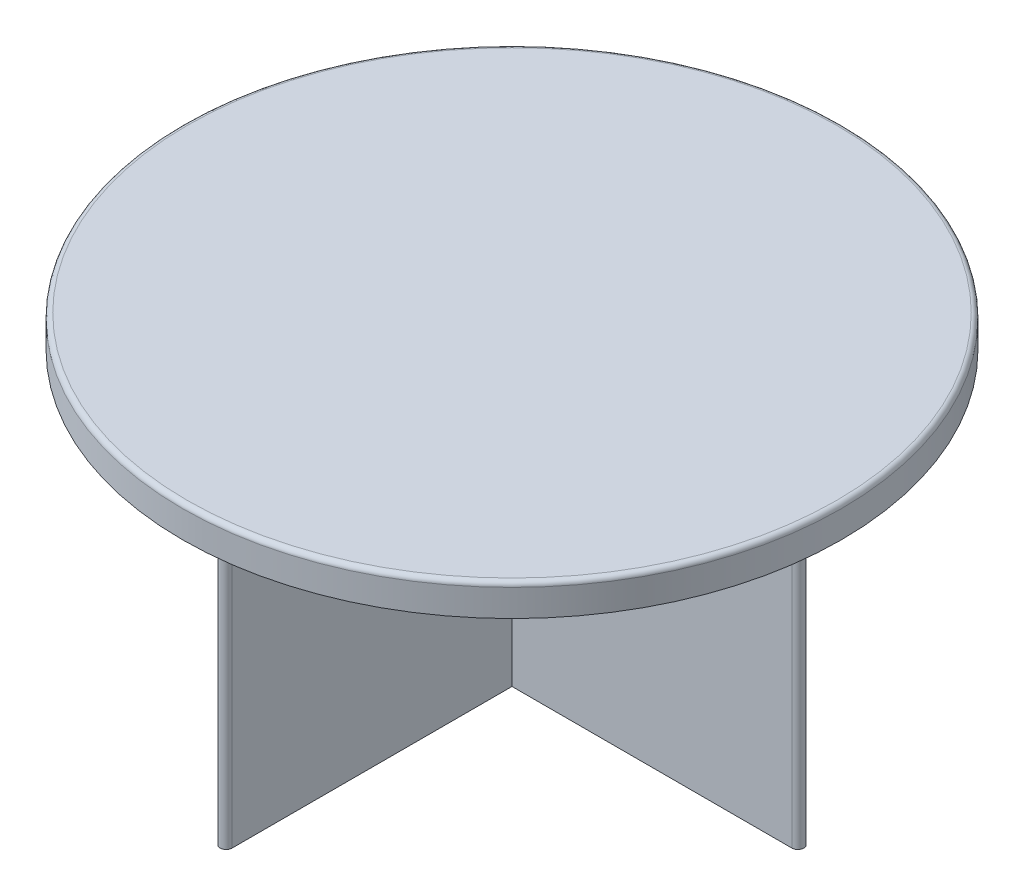
ISO-10303-21;
HEADER;
FILE_DESCRIPTION(('STEP AP214'),'2;1');
FILE_NAME('part.step','',(''),(''),'','','');
FILE_SCHEMA(('AUTOMOTIVE_DESIGN { 1 0 10303 214 1 1 1 1 }'));
ENDSEC;
DATA;
#1=APPLICATION_CONTEXT('core data for automotive mechanical design processes');
#2=APPLICATION_PROTOCOL_DEFINITION('international standard','automotive_design',2000,#1);
#3=PRODUCT_CONTEXT('',#1,'mechanical');
#4=PRODUCT('Part','Part','',(#3));
#5=PRODUCT_RELATED_PRODUCT_CATEGORY('part','',(#4));
#6=PRODUCT_DEFINITION_FORMATION('','',#4);
#7=PRODUCT_DEFINITION_CONTEXT('part definition',#1,'design');
#8=PRODUCT_DEFINITION('design','',#6,#7);
#9=PRODUCT_DEFINITION_SHAPE('','',#8);
#10=(LENGTH_UNIT() NAMED_UNIT(*) SI_UNIT(.MILLI.,.METRE.));
#11=(NAMED_UNIT(*) PLANE_ANGLE_UNIT() SI_UNIT($,.RADIAN.));
#12=(NAMED_UNIT(*) SI_UNIT($,.STERADIAN.) SOLID_ANGLE_UNIT());
#13=UNCERTAINTY_MEASURE_WITH_UNIT(LENGTH_MEASURE(1.E-05),#10,'distance_accuracy_value','');
#14=(GEOMETRIC_REPRESENTATION_CONTEXT(3) GLOBAL_UNCERTAINTY_ASSIGNED_CONTEXT((#13)) GLOBAL_UNIT_ASSIGNED_CONTEXT((#10,
#11,#12)) REPRESENTATION_CONTEXT('',''));
#15=CARTESIAN_POINT('',(0.,0.,0.));
#16=DIRECTION('',(0.,0.,1.));
#17=DIRECTION('',(1.,0.,0.));
#18=AXIS2_PLACEMENT_3D('',#15,#16,#17);
#19=CARTESIAN_POINT('',(0.,50.8,0.));
#20=DIRECTION('',(0.,-1.,0.));
#21=DIRECTION('',(0.,0.,-1.));
#22=AXIS2_PLACEMENT_3D('',#19,#20,#21);
#23=CYLINDRICAL_SURFACE('',#22,527.05);
#24=CARTESIAN_POINT('',(0.,43.18,0.));
#25=DIRECTION('',(0.,1.,0.));
#26=DIRECTION('',(0.,0.,1.));
#27=AXIS2_PLACEMENT_3D('',#24,#25,#26);
#28=CIRCLE('',#27,527.05);
#29=CARTESIAN_POINT('',(0.,43.18,527.05));
#30=VERTEX_POINT('',#29);
#31=EDGE_CURVE('E12',#30,#30,#28,.F.);
#32=ORIENTED_EDGE('',*,*,#31,.T.);
#33=EDGE_LOOP('',(#32));
#34=FACE_BOUND('',#33,.T.);
#35=CARTESIAN_POINT('',(0.,0.,0.));
#36=DIRECTION('',(0.,1.,0.));
#37=DIRECTION('',(0.,0.,1.));
#38=AXIS2_PLACEMENT_3D('',#35,#36,#37);
#39=CIRCLE('',#38,527.05);
#40=CARTESIAN_POINT('',(0.,0.,527.05));
#41=VERTEX_POINT('',#40);
#42=EDGE_CURVE('E163',#41,#41,#39,.T.);
#43=ORIENTED_EDGE('',*,*,#42,.T.);
#44=EDGE_LOOP('',(#43));
#45=FACE_BOUND('',#44,.T.);
#46=ADVANCED_FACE('F57',(#34,#45),#23,.T.);
#47=CARTESIAN_POINT('',(0.,50.8,0.));
#48=DIRECTION('',(0.,1.,0.));
#49=DIRECTION('',(0.,0.,1.));
#50=AXIS2_PLACEMENT_3D('',#47,#48,#49);
#51=PLANE('',#50);
#52=CARTESIAN_POINT('',(0.,50.8,0.));
#53=DIRECTION('',(0.,1.,0.));
#54=DIRECTION('',(0.,0.,1.));
#55=AXIS2_PLACEMENT_3D('',#52,#53,#54);
#56=CIRCLE('',#55,519.43);
#57=CARTESIAN_POINT('',(0.,50.8,519.43));
#58=VERTEX_POINT('',#57);
#59=EDGE_CURVE('E65',#58,#58,#56,.T.);
#60=ORIENTED_EDGE('',*,*,#59,.T.);
#61=EDGE_LOOP('',(#60));
#62=FACE_BOUND('',#61,.T.);
#63=ADVANCED_FACE('F168',(#62),#51,.T.);
#64=CARTESIAN_POINT('',(0.,0.,0.));
#65=DIRECTION('',(0.,1.,0.));
#66=DIRECTION('',(0.,0.,1.));
#67=AXIS2_PLACEMENT_3D('',#64,#65,#66);
#68=PLANE('',#67);
#69=CARTESIAN_POINT('',(-1.61109058612508E-13,0.,457.2));
#70=DIRECTION('',(0.,1.,0.));
#71=DIRECTION('',(0.,0.,1.));
#72=AXIS2_PLACEMENT_3D('',#69,#70,#71);
#73=CIRCLE('',#72,9.525);
#74=CARTESIAN_POINT('',(-9.52500000000016,0.,457.2));
#75=VERTEX_POINT('',#74);
#76=CARTESIAN_POINT('',(9.52499999999984,0.,457.2));
#77=VERTEX_POINT('',#76);
#78=EDGE_CURVE('E127',#75,#77,#73,.T.);
#79=ORIENTED_EDGE('',*,*,#78,.T.);
#80=DIRECTION('',(0.,0.,-1.));
#81=VECTOR('',#80,1.);
#82=CARTESIAN_POINT('',(9.52499999999984,0.,457.2));
#83=LINE('',#82,#81);
#84=CARTESIAN_POINT('',(9.52499999999984,0.,9.525));
#85=VERTEX_POINT('',#84);
#86=EDGE_CURVE('E268',#77,#85,#83,.T.);
#87=ORIENTED_EDGE('',*,*,#86,.T.);
#88=DIRECTION('',(1.,0.,0.));
#89=VECTOR('',#88,1.);
#90=CARTESIAN_POINT('',(-457.2,0.,9.525));
#91=LINE('',#90,#89);
#92=CARTESIAN_POINT('',(457.2,0.,9.525));
#93=VERTEX_POINT('',#92);
#94=EDGE_CURVE('E246',#85,#93,#91,.T.);
#95=ORIENTED_EDGE('',*,*,#94,.T.);
#96=CARTESIAN_POINT('',(457.2,0.,1.67972554971051E-13));
#97=DIRECTION('',(0.,-1.,0.));
#98=DIRECTION('',(0.,0.,-1.));
#99=AXIS2_PLACEMENT_3D('',#96,#97,#98);
#100=CIRCLE('',#99,9.525);
#101=CARTESIAN_POINT('',(457.2,0.,-9.52499999999983));
#102=VERTEX_POINT('',#101);
#103=EDGE_CURVE('E248',#102,#93,#100,.T.);
#104=ORIENTED_EDGE('',*,*,#103,.F.);
#105=DIRECTION('',(1.,0.,0.));
#106=VECTOR('',#105,1.);
#107=CARTESIAN_POINT('',(-457.2,0.,-9.525));
#108=LINE('',#107,#106);
#109=CARTESIAN_POINT('',(9.52499999999984,0.,-9.525));
#110=VERTEX_POINT('',#109);
#111=EDGE_CURVE('E251',#110,#102,#108,.T.);
#112=ORIENTED_EDGE('',*,*,#111,.F.);
#113=CARTESIAN_POINT('',(9.52499999999984,0.,-457.2));
#114=VERTEX_POINT('',#113);
#115=EDGE_CURVE('E133',#110,#114,#83,.T.);
#116=ORIENTED_EDGE('',*,*,#115,.T.);
#117=CARTESIAN_POINT('',(1.18845199672577E-13,0.,-457.2));
#118=DIRECTION('',(0.,-1.,0.));
#119=DIRECTION('',(0.,0.,-1.));
#120=AXIS2_PLACEMENT_3D('',#117,#118,#119);
#121=CIRCLE('',#120,9.525);
#122=CARTESIAN_POINT('',(-9.52499999999988,0.,-457.2));
#123=VERTEX_POINT('',#122);
#124=EDGE_CURVE('E72',#123,#114,#121,.T.);
#125=ORIENTED_EDGE('',*,*,#124,.F.);
#126=DIRECTION('',(0.,0.,-1.));
#127=VECTOR('',#126,1.);
#128=CARTESIAN_POINT('',(-9.52500000000016,0.,457.2));
#129=LINE('',#128,#127);
#130=CARTESIAN_POINT('',(-9.52500000000017,0.,-9.525));
#131=VERTEX_POINT('',#130);
#132=EDGE_CURVE('E141',#131,#123,#129,.T.);
#133=ORIENTED_EDGE('',*,*,#132,.F.);
#134=CARTESIAN_POINT('',(-457.2,0.,-9.525));
#135=VERTEX_POINT('',#134);
#136=EDGE_CURVE('E236',#135,#131,#108,.T.);
#137=ORIENTED_EDGE('',*,*,#136,.F.);
#138=CARTESIAN_POINT('',(-457.2,0.,0.));
#139=DIRECTION('',(0.,1.,0.));
#140=DIRECTION('',(0.,0.,1.));
#141=AXIS2_PLACEMENT_3D('',#138,#139,#140);
#142=CIRCLE('',#141,9.525);
#143=CARTESIAN_POINT('',(-457.2,0.,9.525));
#144=VERTEX_POINT('',#143);
#145=EDGE_CURVE('E123',#135,#144,#142,.T.);
#146=ORIENTED_EDGE('',*,*,#145,.T.);
#147=CARTESIAN_POINT('',(-9.52500000000017,0.,9.525));
#148=VERTEX_POINT('',#147);
#149=EDGE_CURVE('E139',#144,#148,#91,.T.);
#150=ORIENTED_EDGE('',*,*,#149,.T.);
#151=EDGE_CURVE('E116',#75,#148,#129,.T.);
#152=ORIENTED_EDGE('',*,*,#151,.F.);
#153=EDGE_LOOP('',(#79,#87,#95,#104,#112,#116,#125,#133,#137,#146,#150,#152));
#154=FACE_BOUND('',#153,.T.);
#155=ORIENTED_EDGE('',*,*,#42,.F.);
#156=EDGE_LOOP('',(#155));
#157=FACE_BOUND('',#156,.T.);
#158=ADVANCED_FACE('F135',(#154,#157),#68,.F.);
#159=CARTESIAN_POINT('',(0.,43.18,0.));
#160=DIRECTION('',(0.,1.,0.));
#161=DIRECTION('',(0.,0.,1.));
#162=AXIS2_PLACEMENT_3D('',#159,#160,#161);
#163=TOROIDAL_SURFACE('',#162,519.43,7.62);
#164=ORIENTED_EDGE('',*,*,#31,.F.);
#165=EDGE_LOOP('',(#164));
#166=FACE_BOUND('',#165,.T.);
#167=ORIENTED_EDGE('',*,*,#59,.F.);
#168=EDGE_LOOP('',(#167));
#169=FACE_BOUND('',#168,.T.);
#170=ADVANCED_FACE('F59',(#166,#169),#163,.T.);
#171=CARTESIAN_POINT('',(-457.2,-457.2,-9.525));
#172=DIRECTION('',(0.,0.,1.));
#173=DIRECTION('',(1.,0.,0.));
#174=AXIS2_PLACEMENT_3D('',#171,#172,#173);
#175=PLANE('',#174);
#176=DIRECTION('',(1.,0.,0.));
#177=VECTOR('',#176,1.);
#178=CARTESIAN_POINT('',(-457.2,-457.2,-9.525));
#179=LINE('',#178,#177);
#180=CARTESIAN_POINT('',(9.52499999999984,-457.2,-9.525));
#181=VERTEX_POINT('',#180);
#182=CARTESIAN_POINT('',(457.2,-457.2,-9.52499999999983));
#183=VERTEX_POINT('',#182);
#184=EDGE_CURVE('E240',#181,#183,#179,.T.);
#185=ORIENTED_EDGE('',*,*,#184,.F.);
#186=DIRECTION('',(0.,1.,0.));
#187=VECTOR('',#186,1.);
#188=CARTESIAN_POINT('',(9.52499999999984,-457.2,-9.525));
#189=LINE('',#188,#187);
#190=EDGE_CURVE('E155',#181,#110,#189,.T.);
#191=ORIENTED_EDGE('',*,*,#190,.T.);
#192=ORIENTED_EDGE('',*,*,#111,.T.);
#193=DIRECTION('',(0.,1.,0.));
#194=VECTOR('',#193,1.);
#195=CARTESIAN_POINT('',(457.2,-457.2,-9.52499999999983));
#196=LINE('',#195,#194);
#197=EDGE_CURVE('E256',#183,#102,#196,.T.);
#198=ORIENTED_EDGE('',*,*,#197,.F.);
#199=EDGE_LOOP('',(#185,#191,#192,#198));
#200=FACE_BOUND('',#199,.T.);
#201=ADVANCED_FACE('F171',(#200),#175,.F.);
#202=CARTESIAN_POINT('',(457.2,-457.2,1.67972554971051E-13));
#203=DIRECTION('',(0.,1.,0.));
#204=DIRECTION('',(0.,0.,1.));
#205=AXIS2_PLACEMENT_3D('',#202,#203,#204);
#206=CYLINDRICAL_SURFACE('',#205,9.525);
#207=ORIENTED_EDGE('',*,*,#103,.T.);
#208=DIRECTION('',(0.,1.,0.));
#209=VECTOR('',#208,1.);
#210=CARTESIAN_POINT('',(457.2,-457.2,9.525));
#211=LINE('',#210,#209);
#212=CARTESIAN_POINT('',(457.2,-457.2,9.525));
#213=VERTEX_POINT('',#212);
#214=EDGE_CURVE('E259',#213,#93,#211,.T.);
#215=ORIENTED_EDGE('',*,*,#214,.F.);
#216=CARTESIAN_POINT('',(457.2,-457.2,1.67972554971051E-13));
#217=DIRECTION('',(0.,-1.,0.));
#218=DIRECTION('',(0.,0.,-1.));
#219=AXIS2_PLACEMENT_3D('',#216,#217,#218);
#220=CIRCLE('',#219,9.525);
#221=EDGE_CURVE('E228',#183,#213,#220,.T.);
#222=ORIENTED_EDGE('',*,*,#221,.F.);
#223=ORIENTED_EDGE('',*,*,#197,.T.);
#224=EDGE_LOOP('',(#207,#215,#222,#223));
#225=FACE_BOUND('',#224,.T.);
#226=ADVANCED_FACE('F177',(#225),#206,.T.);
#227=CARTESIAN_POINT('',(-457.2,-457.2,9.525));
#228=DIRECTION('',(0.,0.,1.));
#229=DIRECTION('',(1.,0.,0.));
#230=AXIS2_PLACEMENT_3D('',#227,#228,#229);
#231=PLANE('',#230);
#232=DIRECTION('',(0.,1.,0.));
#233=VECTOR('',#232,1.);
#234=CARTESIAN_POINT('',(9.52499999999984,-457.2,9.525));
#235=LINE('',#234,#233);
#236=CARTESIAN_POINT('',(9.52499999999984,-457.2,9.525));
#237=VERTEX_POINT('',#236);
#238=EDGE_CURVE('E81',#237,#85,#235,.T.);
#239=ORIENTED_EDGE('',*,*,#238,.F.);
#240=DIRECTION('',(1.,0.,0.));
#241=VECTOR('',#240,1.);
#242=CARTESIAN_POINT('',(-457.2,-457.2,9.525));
#243=LINE('',#242,#241);
#244=EDGE_CURVE('E223',#237,#213,#243,.T.);
#245=ORIENTED_EDGE('',*,*,#244,.T.);
#246=ORIENTED_EDGE('',*,*,#214,.T.);
#247=ORIENTED_EDGE('',*,*,#94,.F.);
#248=EDGE_LOOP('',(#239,#245,#246,#247));
#249=FACE_BOUND('',#248,.T.);
#250=ADVANCED_FACE('F210',(#249),#231,.T.);
#251=CARTESIAN_POINT('',(-457.2,-457.2,0.));
#252=DIRECTION('',(0.,1.,0.));
#253=DIRECTION('',(0.,0.,1.));
#254=AXIS2_PLACEMENT_3D('',#251,#252,#253);
#255=PLANE('',#254);
#256=ORIENTED_EDGE('',*,*,#244,.F.);
#257=DIRECTION('',(0.,0.,-1.));
#258=VECTOR('',#257,1.);
#259=CARTESIAN_POINT('',(9.52499999999984,-457.2,457.2));
#260=LINE('',#259,#258);
#261=CARTESIAN_POINT('',(9.52499999999984,-457.2,457.2));
#262=VERTEX_POINT('',#261);
#263=EDGE_CURVE('E224',#262,#237,#260,.T.);
#264=ORIENTED_EDGE('',*,*,#263,.F.);
#265=CARTESIAN_POINT('',(-1.61109058612508E-13,-457.2,457.2));
#266=DIRECTION('',(0.,1.,0.));
#267=DIRECTION('',(0.,0.,1.));
#268=AXIS2_PLACEMENT_3D('',#265,#266,#267);
#269=CIRCLE('',#268,9.525);
#270=CARTESIAN_POINT('',(-9.52500000000016,-457.2,457.2));
#271=VERTEX_POINT('',#270);
#272=EDGE_CURVE('E140',#271,#262,#269,.T.);
#273=ORIENTED_EDGE('',*,*,#272,.F.);
#274=DIRECTION('',(0.,0.,-1.));
#275=VECTOR('',#274,1.);
#276=CARTESIAN_POINT('',(-9.52500000000016,-457.2,457.2));
#277=LINE('',#276,#275);
#278=CARTESIAN_POINT('',(-9.52500000000017,-457.2,9.525));
#279=VERTEX_POINT('',#278);
#280=EDGE_CURVE('E119',#271,#279,#277,.T.);
#281=ORIENTED_EDGE('',*,*,#280,.T.);
#282=CARTESIAN_POINT('',(-457.2,-457.2,9.525));
#283=VERTEX_POINT('',#282);
#284=EDGE_CURVE('E231',#283,#279,#243,.T.);
#285=ORIENTED_EDGE('',*,*,#284,.F.);
#286=CARTESIAN_POINT('',(-457.2,-457.2,0.));
#287=DIRECTION('',(0.,1.,0.));
#288=DIRECTION('',(0.,0.,1.));
#289=AXIS2_PLACEMENT_3D('',#286,#287,#288);
#290=CIRCLE('',#289,9.525);
#291=CARTESIAN_POINT('',(-457.2,-457.2,-9.525));
#292=VERTEX_POINT('',#291);
#293=EDGE_CURVE('E232',#292,#283,#290,.T.);
#294=ORIENTED_EDGE('',*,*,#293,.F.);
#295=CARTESIAN_POINT('',(-9.52500000000017,-457.2,-9.525));
#296=VERTEX_POINT('',#295);
#297=EDGE_CURVE('E241',#292,#296,#179,.T.);
#298=ORIENTED_EDGE('',*,*,#297,.T.);
#299=CARTESIAN_POINT('',(-9.52499999999988,-457.2,-457.2));
#300=VERTEX_POINT('',#299);
#301=EDGE_CURVE('E267',#296,#300,#277,.T.);
#302=ORIENTED_EDGE('',*,*,#301,.T.);
#303=CARTESIAN_POINT('',(1.18845199672577E-13,-457.2,-457.2));
#304=DIRECTION('',(0.,-1.,0.));
#305=DIRECTION('',(0.,0.,-1.));
#306=AXIS2_PLACEMENT_3D('',#303,#304,#305);
#307=CIRCLE('',#306,9.525);
#308=CARTESIAN_POINT('',(9.52499999999984,-457.2,-457.2));
#309=VERTEX_POINT('',#308);
#310=EDGE_CURVE('E264',#300,#309,#307,.T.);
#311=ORIENTED_EDGE('',*,*,#310,.T.);
#312=EDGE_CURVE('E143',#181,#309,#260,.T.);
#313=ORIENTED_EDGE('',*,*,#312,.F.);
#314=ORIENTED_EDGE('',*,*,#184,.T.);
#315=ORIENTED_EDGE('',*,*,#221,.T.);
#316=EDGE_LOOP('',(#256,#264,#273,#281,#285,#294,#298,#302,#311,#313,#314,#315));
#317=FACE_BOUND('',#316,.T.);
#318=ADVANCED_FACE('F208',(#317),#255,.F.);
#319=CARTESIAN_POINT('',(-457.2,-457.2,0.));
#320=DIRECTION('',(0.,1.,0.));
#321=DIRECTION('',(0.,0.,1.));
#322=AXIS2_PLACEMENT_3D('',#319,#320,#321);
#323=CYLINDRICAL_SURFACE('',#322,9.525);
#324=ORIENTED_EDGE('',*,*,#145,.F.);
#325=DIRECTION('',(0.,1.,0.));
#326=VECTOR('',#325,1.);
#327=CARTESIAN_POINT('',(-457.2,-457.2,-9.525));
#328=LINE('',#327,#326);
#329=EDGE_CURVE('E154',#292,#135,#328,.T.);
#330=ORIENTED_EDGE('',*,*,#329,.F.);
#331=ORIENTED_EDGE('',*,*,#293,.T.);
#332=DIRECTION('',(0.,1.,0.));
#333=VECTOR('',#332,1.);
#334=CARTESIAN_POINT('',(-457.2,-457.2,9.525));
#335=LINE('',#334,#333);
#336=EDGE_CURVE('E244',#283,#144,#335,.T.);
#337=ORIENTED_EDGE('',*,*,#336,.T.);
#338=EDGE_LOOP('',(#324,#330,#331,#337));
#339=FACE_BOUND('',#338,.T.);
#340=ADVANCED_FACE('F205',(#339),#323,.T.);
#341=DIRECTION('',(0.,1.,0.));
#342=VECTOR('',#341,1.);
#343=CARTESIAN_POINT('',(-9.52500000000017,-457.2,-9.525));
#344=LINE('',#343,#342);
#345=EDGE_CURVE('E158',#296,#131,#344,.T.);
#346=ORIENTED_EDGE('',*,*,#345,.F.);
#347=ORIENTED_EDGE('',*,*,#297,.F.);
#348=ORIENTED_EDGE('',*,*,#329,.T.);
#349=ORIENTED_EDGE('',*,*,#136,.T.);
#350=EDGE_LOOP('',(#346,#347,#348,#349));
#351=FACE_BOUND('',#350,.T.);
#352=ADVANCED_FACE('F180',(#351),#175,.F.);
#353=ORIENTED_EDGE('',*,*,#284,.T.);
#354=DIRECTION('',(0.,1.,0.));
#355=VECTOR('',#354,1.);
#356=CARTESIAN_POINT('',(-9.52500000000017,-457.2,9.525));
#357=LINE('',#356,#355);
#358=EDGE_CURVE('E153',#279,#148,#357,.T.);
#359=ORIENTED_EDGE('',*,*,#358,.T.);
#360=ORIENTED_EDGE('',*,*,#149,.F.);
#361=ORIENTED_EDGE('',*,*,#336,.F.);
#362=EDGE_LOOP('',(#353,#359,#360,#361));
#363=FACE_BOUND('',#362,.T.);
#364=ADVANCED_FACE('F193',(#363),#231,.T.);
#365=CARTESIAN_POINT('',(-1.61109058612508E-13,-457.2,457.2));
#366=DIRECTION('',(0.,1.,0.));
#367=DIRECTION('',(0.,0.,1.));
#368=AXIS2_PLACEMENT_3D('',#365,#366,#367);
#369=CYLINDRICAL_SURFACE('',#368,9.525);
#370=ORIENTED_EDGE('',*,*,#78,.F.);
#371=DIRECTION('',(0.,1.,0.));
#372=VECTOR('',#371,1.);
#373=CARTESIAN_POINT('',(-9.52500000000016,-457.2,457.2));
#374=LINE('',#373,#372);
#375=EDGE_CURVE('E111',#271,#75,#374,.T.);
#376=ORIENTED_EDGE('',*,*,#375,.F.);
#377=ORIENTED_EDGE('',*,*,#272,.T.);
#378=DIRECTION('',(0.,1.,0.));
#379=VECTOR('',#378,1.);
#380=CARTESIAN_POINT('',(9.52499999999984,-457.2,457.2));
#381=LINE('',#380,#379);
#382=EDGE_CURVE('E129',#262,#77,#381,.T.);
#383=ORIENTED_EDGE('',*,*,#382,.T.);
#384=EDGE_LOOP('',(#370,#376,#377,#383));
#385=FACE_BOUND('',#384,.T.);
#386=ADVANCED_FACE('F128',(#385),#369,.T.);
#387=CARTESIAN_POINT('',(-9.52500000000016,-457.2,457.2));
#388=DIRECTION('',(1.,0.,0.));
#389=DIRECTION('',(0.,0.,-1.));
#390=AXIS2_PLACEMENT_3D('',#387,#388,#389);
#391=PLANE('',#390);
#392=ORIENTED_EDGE('',*,*,#358,.F.);
#393=ORIENTED_EDGE('',*,*,#280,.F.);
#394=ORIENTED_EDGE('',*,*,#375,.T.);
#395=ORIENTED_EDGE('',*,*,#151,.T.);
#396=EDGE_LOOP('',(#392,#393,#394,#395));
#397=FACE_BOUND('',#396,.T.);
#398=ADVANCED_FACE('F113',(#397),#391,.F.);
#399=CARTESIAN_POINT('',(9.52499999999984,-457.2,457.2));
#400=DIRECTION('',(1.,0.,0.));
#401=DIRECTION('',(0.,0.,-1.));
#402=AXIS2_PLACEMENT_3D('',#399,#400,#401);
#403=PLANE('',#402);
#404=ORIENTED_EDGE('',*,*,#263,.T.);
#405=ORIENTED_EDGE('',*,*,#238,.T.);
#406=ORIENTED_EDGE('',*,*,#86,.F.);
#407=ORIENTED_EDGE('',*,*,#382,.F.);
#408=EDGE_LOOP('',(#404,#405,#406,#407));
#409=FACE_BOUND('',#408,.T.);
#410=ADVANCED_FACE('F194',(#409),#403,.T.);
#411=ORIENTED_EDGE('',*,*,#301,.F.);
#412=ORIENTED_EDGE('',*,*,#345,.T.);
#413=ORIENTED_EDGE('',*,*,#132,.T.);
#414=DIRECTION('',(0.,1.,0.));
#415=VECTOR('',#414,1.);
#416=CARTESIAN_POINT('',(-9.52499999999988,-457.2,-457.2));
#417=LINE('',#416,#415);
#418=EDGE_CURVE('E124',#300,#123,#417,.T.);
#419=ORIENTED_EDGE('',*,*,#418,.F.);
#420=EDGE_LOOP('',(#411,#412,#413,#419));
#421=FACE_BOUND('',#420,.T.);
#422=ADVANCED_FACE('F197',(#421),#391,.F.);
#423=CARTESIAN_POINT('',(1.18845199672577E-13,-457.2,-457.2));
#424=DIRECTION('',(0.,1.,0.));
#425=DIRECTION('',(0.,0.,1.));
#426=AXIS2_PLACEMENT_3D('',#423,#424,#425);
#427=CYLINDRICAL_SURFACE('',#426,9.525);
#428=ORIENTED_EDGE('',*,*,#124,.T.);
#429=DIRECTION('',(0.,1.,0.));
#430=VECTOR('',#429,1.);
#431=CARTESIAN_POINT('',(9.52499999999984,-457.2,-457.2));
#432=LINE('',#431,#430);
#433=EDGE_CURVE('E149',#309,#114,#432,.T.);
#434=ORIENTED_EDGE('',*,*,#433,.F.);
#435=ORIENTED_EDGE('',*,*,#310,.F.);
#436=ORIENTED_EDGE('',*,*,#418,.T.);
#437=EDGE_LOOP('',(#428,#434,#435,#436));
#438=FACE_BOUND('',#437,.T.);
#439=ADVANCED_FACE('F200',(#438),#427,.T.);
#440=ORIENTED_EDGE('',*,*,#190,.F.);
#441=ORIENTED_EDGE('',*,*,#312,.T.);
#442=ORIENTED_EDGE('',*,*,#433,.T.);
#443=ORIENTED_EDGE('',*,*,#115,.F.);
#444=EDGE_LOOP('',(#440,#441,#442,#443));
#445=FACE_BOUND('',#444,.T.);
#446=ADVANCED_FACE('F199',(#445),#403,.T.);
#447=CLOSED_SHELL('',(#46,#63,#158,#170,#201,#226,#250,#318,#340,#352,#364,#386,#398,#410,#422,
#439,#446));
#448=MANIFOLD_SOLID_BREP('B2',#447);
#449=ADVANCED_BREP_SHAPE_REPRESENTATION('',(#18,#448),#14);
#450=SHAPE_DEFINITION_REPRESENTATION(#9,#449);
ENDSEC;
END-ISO-10303-21;
